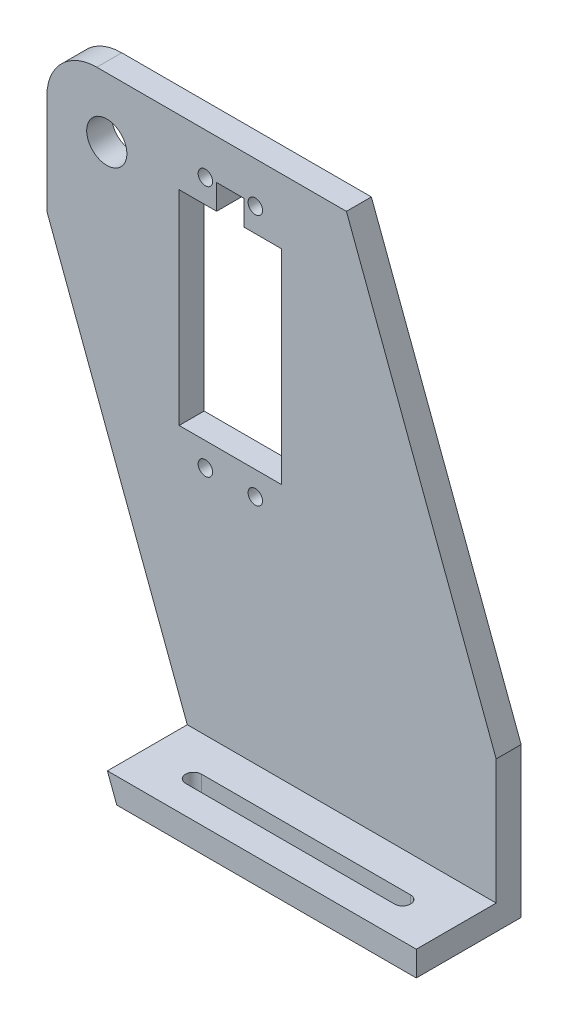
ISO-10303-21;
HEADER;
FILE_DESCRIPTION(('STEP AP214'),'2;1');
FILE_NAME('part.step','',(''),(''),'','','');
FILE_SCHEMA(('AUTOMOTIVE_DESIGN { 1 0 10303 214 1 1 1 1 }'));
ENDSEC;
DATA;
#1=APPLICATION_CONTEXT('core data for automotive mechanical design processes');
#2=APPLICATION_PROTOCOL_DEFINITION('international standard','automotive_design',2000,#1);
#3=PRODUCT_CONTEXT('',#1,'mechanical');
#4=PRODUCT('Part','Part','',(#3));
#5=PRODUCT_RELATED_PRODUCT_CATEGORY('part','',(#4));
#6=PRODUCT_DEFINITION_FORMATION('','',#4);
#7=PRODUCT_DEFINITION_CONTEXT('part definition',#1,'design');
#8=PRODUCT_DEFINITION('design','',#6,#7);
#9=PRODUCT_DEFINITION_SHAPE('','',#8);
#10=(LENGTH_UNIT() NAMED_UNIT(*) SI_UNIT(.MILLI.,.METRE.));
#11=(NAMED_UNIT(*) PLANE_ANGLE_UNIT() SI_UNIT($,.RADIAN.));
#12=(NAMED_UNIT(*) SI_UNIT($,.STERADIAN.) SOLID_ANGLE_UNIT());
#13=UNCERTAINTY_MEASURE_WITH_UNIT(LENGTH_MEASURE(1.E-05),#10,'distance_accuracy_value','');
#14=(GEOMETRIC_REPRESENTATION_CONTEXT(3) GLOBAL_UNCERTAINTY_ASSIGNED_CONTEXT((#13)) GLOBAL_UNIT_ASSIGNED_CONTEXT((#10,
#11,#12)) REPRESENTATION_CONTEXT('',''));
#15=CARTESIAN_POINT('',(0.,0.,0.));
#16=DIRECTION('',(0.,0.,1.));
#17=DIRECTION('',(1.,0.,0.));
#18=AXIS2_PLACEMENT_3D('',#15,#16,#17);
#19=CARTESIAN_POINT('',(-45.,2.5,21.));
#20=DIRECTION('',(0.,-1.,0.));
#21=DIRECTION('',(0.,0.,-1.));
#22=AXIS2_PLACEMENT_3D('',#19,#20,#21);
#23=PLANE('',#22);
#24=DIRECTION('',(1.,0.,0.));
#25=VECTOR('',#24,1.);
#26=CARTESIAN_POINT('',(-6.87500000000002,2.5,15.35));
#27=LINE('',#26,#25);
#28=CARTESIAN_POINT('',(-6.87500000000001,2.5,15.35));
#29=VERTEX_POINT('',#28);
#30=CARTESIAN_POINT('',(35.,2.5,15.35));
#31=VERTEX_POINT('',#30);
#32=EDGE_CURVE('E201',#29,#31,#27,.T.);
#33=ORIENTED_EDGE('',*,*,#32,.F.);
#34=CARTESIAN_POINT('',(-6.87500000000002,2.5,13.75));
#35=DIRECTION('',(0.,1.,0.));
#36=DIRECTION('',(0.,0.,1.));
#37=AXIS2_PLACEMENT_3D('',#34,#35,#36);
#38=CIRCLE('',#37,1.6);
#39=CARTESIAN_POINT('',(-6.87500000000002,2.5,12.15));
#40=VERTEX_POINT('',#39);
#41=EDGE_CURVE('E60',#40,#29,#38,.T.);
#42=ORIENTED_EDGE('',*,*,#41,.F.);
#43=DIRECTION('',(-1.,0.,0.));
#44=VECTOR('',#43,1.);
#45=CARTESIAN_POINT('',(-6.87500000000002,2.5,12.15));
#46=LINE('',#45,#44);
#47=CARTESIAN_POINT('',(35.,2.5,12.15));
#48=VERTEX_POINT('',#47);
#49=EDGE_CURVE('E208',#48,#40,#46,.T.);
#50=ORIENTED_EDGE('',*,*,#49,.F.);
#51=CARTESIAN_POINT('',(35.,2.5,13.75));
#52=DIRECTION('',(0.,1.,0.));
#53=DIRECTION('',(0.,0.,1.));
#54=AXIS2_PLACEMENT_3D('',#51,#52,#53);
#55=CIRCLE('',#54,1.6);
#56=EDGE_CURVE('E191',#31,#48,#55,.T.);
#57=ORIENTED_EDGE('',*,*,#56,.F.);
#58=EDGE_LOOP('',(#33,#42,#50,#57));
#59=FACE_BOUND('',#58,.T.);
#60=DIRECTION('',(1.,0.,0.));
#61=VECTOR('',#60,1.);
#62=CARTESIAN_POINT('',(-45.,2.5,5.));
#63=LINE('',#62,#61);
#64=CARTESIAN_POINT('',(-16.875,2.49999999999999,5.));
#65=VERTEX_POINT('',#64);
#66=CARTESIAN_POINT('',(45.,2.5,5.));
#67=VERTEX_POINT('',#66);
#68=EDGE_CURVE('E373',#65,#67,#63,.T.);
#69=ORIENTED_EDGE('',*,*,#68,.F.);
#70=DIRECTION('',(0.,0.,1.));
#71=VECTOR('',#70,1.);
#72=CARTESIAN_POINT('',(-16.875,2.5,21.));
#73=LINE('',#72,#71);
#74=CARTESIAN_POINT('',(-16.875,2.5,21.));
#75=VERTEX_POINT('',#74);
#76=EDGE_CURVE('E364',#65,#75,#73,.T.);
#77=ORIENTED_EDGE('',*,*,#76,.T.);
#78=DIRECTION('',(-1.,0.,0.));
#79=VECTOR('',#78,1.);
#80=CARTESIAN_POINT('',(-45.,2.5,21.));
#81=LINE('',#80,#79);
#82=CARTESIAN_POINT('',(45.,2.5,21.));
#83=VERTEX_POINT('',#82);
#84=EDGE_CURVE('E399',#83,#75,#81,.T.);
#85=ORIENTED_EDGE('',*,*,#84,.F.);
#86=DIRECTION('',(0.,0.,-1.));
#87=VECTOR('',#86,1.);
#88=CARTESIAN_POINT('',(45.,2.5,21.));
#89=LINE('',#88,#87);
#90=EDGE_CURVE('E420',#83,#67,#89,.T.);
#91=ORIENTED_EDGE('',*,*,#90,.T.);
#92=EDGE_LOOP('',(#69,#77,#85,#91));
#93=FACE_BOUND('',#92,.T.);
#94=ADVANCED_FACE('F44',(#59,#93),#23,.F.);
#95=CARTESIAN_POINT('',(45.,2.5,21.));
#96=DIRECTION('',(-1.,0.,0.));
#97=DIRECTION('',(0.,0.,1.));
#98=AXIS2_PLACEMENT_3D('',#95,#96,#97);
#99=PLANE('',#98);
#100=DIRECTION('',(0.,1.,0.));
#101=VECTOR('',#100,1.);
#102=CARTESIAN_POINT('',(45.,2.5,0.));
#103=LINE('',#102,#101);
#104=CARTESIAN_POINT('',(45.,-2.5,0.));
#105=VERTEX_POINT('',#104);
#106=CARTESIAN_POINT('',(45.,27.5,0.));
#107=VERTEX_POINT('',#106);
#108=EDGE_CURVE('E394',#105,#107,#103,.T.);
#109=ORIENTED_EDGE('',*,*,#108,.T.);
#110=DIRECTION('',(0.,0.,1.));
#111=VECTOR('',#110,1.);
#112=CARTESIAN_POINT('',(45.,27.5,0.));
#113=LINE('',#112,#111);
#114=CARTESIAN_POINT('',(45.,27.5,5.));
#115=VERTEX_POINT('',#114);
#116=EDGE_CURVE('E332',#107,#115,#113,.T.);
#117=ORIENTED_EDGE('',*,*,#116,.T.);
#118=DIRECTION('',(0.,-1.,0.));
#119=VECTOR('',#118,1.);
#120=CARTESIAN_POINT('',(45.,107.5,5.));
#121=LINE('',#120,#119);
#122=EDGE_CURVE('E384',#115,#67,#121,.T.);
#123=ORIENTED_EDGE('',*,*,#122,.T.);
#124=ORIENTED_EDGE('',*,*,#90,.F.);
#125=DIRECTION('',(0.,1.,0.));
#126=VECTOR('',#125,1.);
#127=CARTESIAN_POINT('',(45.,2.5,21.));
#128=LINE('',#127,#126);
#129=CARTESIAN_POINT('',(45.,-2.5,21.));
#130=VERTEX_POINT('',#129);
#131=EDGE_CURVE('E395',#130,#83,#128,.T.);
#132=ORIENTED_EDGE('',*,*,#131,.F.);
#133=DIRECTION('',(0.,0.,-1.));
#134=VECTOR('',#133,1.);
#135=CARTESIAN_POINT('',(45.,-2.5,21.));
#136=LINE('',#135,#134);
#137=EDGE_CURVE('E407',#130,#105,#136,.T.);
#138=ORIENTED_EDGE('',*,*,#137,.T.);
#139=EDGE_LOOP('',(#109,#117,#123,#124,#132,#138));
#140=FACE_BOUND('',#139,.T.);
#141=ADVANCED_FACE('F470',(#140),#99,.F.);
#142=CARTESIAN_POINT('',(-45.,2.5,21.));
#143=DIRECTION('',(1.,0.,0.));
#144=DIRECTION('',(0.,0.,-1.));
#145=AXIS2_PLACEMENT_3D('',#142,#143,#144);
#146=PLANE('',#145);
#147=DIRECTION('',(0.,-1.,0.));
#148=VECTOR('',#147,1.);
#149=CARTESIAN_POINT('',(-45.,2.5,0.));
#150=LINE('',#149,#148);
#151=CARTESIAN_POINT('',(-45.,97.5,0.));
#152=VERTEX_POINT('',#151);
#153=CARTESIAN_POINT('',(-45.,77.5,0.));
#154=VERTEX_POINT('',#153);
#155=EDGE_CURVE('E411',#152,#154,#150,.T.);
#156=ORIENTED_EDGE('',*,*,#155,.T.);
#157=DIRECTION('',(0.,0.,1.));
#158=VECTOR('',#157,1.);
#159=CARTESIAN_POINT('',(-45.,77.5,0.));
#160=LINE('',#159,#158);
#161=CARTESIAN_POINT('',(-45.,77.5,5.));
#162=VERTEX_POINT('',#161);
#163=EDGE_CURVE('E345',#154,#162,#160,.T.);
#164=ORIENTED_EDGE('',*,*,#163,.T.);
#165=DIRECTION('',(0.,-1.,0.));
#166=VECTOR('',#165,1.);
#167=CARTESIAN_POINT('',(-45.,107.5,5.));
#168=LINE('',#167,#166);
#169=CARTESIAN_POINT('',(-45.,97.5,5.));
#170=VERTEX_POINT('',#169);
#171=EDGE_CURVE('E390',#170,#162,#168,.T.);
#172=ORIENTED_EDGE('',*,*,#171,.F.);
#173=DIRECTION('',(0.,0.,1.));
#174=VECTOR('',#173,1.);
#175=CARTESIAN_POINT('',(-45.,97.5,0.));
#176=LINE('',#175,#174);
#177=EDGE_CURVE('E431',#170,#152,#176,.F.);
#178=ORIENTED_EDGE('',*,*,#177,.T.);
#179=EDGE_LOOP('',(#156,#164,#172,#178));
#180=FACE_BOUND('',#179,.T.);
#181=ADVANCED_FACE('F475',(#180),#146,.F.);
#182=CARTESIAN_POINT('',(-45.,-2.5,21.));
#183=DIRECTION('',(0.,1.,0.));
#184=DIRECTION('',(0.,0.,1.));
#185=AXIS2_PLACEMENT_3D('',#182,#183,#184);
#186=PLANE('',#185);
#187=DIRECTION('',(-1.,0.,0.));
#188=VECTOR('',#187,1.);
#189=CARTESIAN_POINT('',(-45.,-2.5,12.15));
#190=LINE('',#189,#188);
#191=CARTESIAN_POINT('',(35.,-2.5,12.15));
#192=VERTEX_POINT('',#191);
#193=CARTESIAN_POINT('',(-6.87500000000002,-2.5,12.15));
#194=VERTEX_POINT('',#193);
#195=EDGE_CURVE('E53',#192,#194,#190,.T.);
#196=ORIENTED_EDGE('',*,*,#195,.T.);
#197=CARTESIAN_POINT('',(-6.87500000000002,-2.5,13.75));
#198=DIRECTION('',(0.,1.,0.));
#199=DIRECTION('',(0.,0.,1.));
#200=AXIS2_PLACEMENT_3D('',#197,#198,#199);
#201=CIRCLE('',#200,1.6);
#202=CARTESIAN_POINT('',(-6.87500000000002,-2.5,15.35));
#203=VERTEX_POINT('',#202);
#204=EDGE_CURVE('E11',#194,#203,#201,.T.);
#205=ORIENTED_EDGE('',*,*,#204,.T.);
#206=DIRECTION('',(1.,0.,0.));
#207=VECTOR('',#206,1.);
#208=CARTESIAN_POINT('',(-45.,-2.5,15.35));
#209=LINE('',#208,#207);
#210=CARTESIAN_POINT('',(35.,-2.5,15.35));
#211=VERTEX_POINT('',#210);
#212=EDGE_CURVE('E442',#203,#211,#209,.T.);
#213=ORIENTED_EDGE('',*,*,#212,.T.);
#214=CARTESIAN_POINT('',(35.,-2.5,13.75));
#215=DIRECTION('',(0.,1.,0.));
#216=DIRECTION('',(0.,0.,1.));
#217=AXIS2_PLACEMENT_3D('',#214,#215,#216);
#218=CIRCLE('',#217,1.6);
#219=EDGE_CURVE('E194',#211,#192,#218,.T.);
#220=ORIENTED_EDGE('',*,*,#219,.T.);
#221=EDGE_LOOP('',(#196,#205,#213,#220));
#222=FACE_BOUND('',#221,.T.);
#223=DIRECTION('',(1.,0.,0.));
#224=VECTOR('',#223,1.);
#225=CARTESIAN_POINT('',(-45.,-2.5,21.));
#226=LINE('',#225,#224);
#227=CARTESIAN_POINT('',(-15.,-2.5,21.));
#228=VERTEX_POINT('',#227);
#229=EDGE_CURVE('E404',#228,#130,#226,.T.);
#230=ORIENTED_EDGE('',*,*,#229,.F.);
#231=DIRECTION('',(0.,0.,1.));
#232=VECTOR('',#231,1.);
#233=CARTESIAN_POINT('',(-15.,-2.5,0.));
#234=LINE('',#233,#232);
#235=CARTESIAN_POINT('',(-15.,-2.5,0.));
#236=VERTEX_POINT('',#235);
#237=EDGE_CURVE('E340',#236,#228,#234,.T.);
#238=ORIENTED_EDGE('',*,*,#237,.F.);
#239=DIRECTION('',(1.,0.,0.));
#240=VECTOR('',#239,1.);
#241=CARTESIAN_POINT('',(-45.,-2.5,0.));
#242=LINE('',#241,#240);
#243=EDGE_CURVE('E400',#236,#105,#242,.T.);
#244=ORIENTED_EDGE('',*,*,#243,.T.);
#245=ORIENTED_EDGE('',*,*,#137,.F.);
#246=EDGE_LOOP('',(#230,#238,#244,#245));
#247=FACE_BOUND('',#246,.T.);
#248=ADVANCED_FACE('F449',(#222,#247),#186,.F.);
#249=CARTESIAN_POINT('',(0.,0.,21.));
#250=DIRECTION('',(0.,0.,1.));
#251=DIRECTION('',(1.,0.,0.));
#252=AXIS2_PLACEMENT_3D('',#249,#250,#251);
#253=PLANE('',#252);
#254=DIRECTION('',(-0.351123441588392,0.936329177569045,0.));
#255=VECTOR('',#254,1.);
#256=CARTESIAN_POINT('',(-45.,77.5,21.));
#257=LINE('',#256,#255);
#258=EDGE_CURVE('E341',#228,#75,#257,.T.);
#259=ORIENTED_EDGE('',*,*,#258,.F.);
#260=ORIENTED_EDGE('',*,*,#229,.T.);
#261=ORIENTED_EDGE('',*,*,#131,.T.);
#262=ORIENTED_EDGE('',*,*,#84,.T.);
#263=EDGE_LOOP('',(#259,#260,#261,#262));
#264=FACE_BOUND('',#263,.T.);
#265=ADVANCED_FACE('F482',(#264),#253,.T.);
#266=CARTESIAN_POINT('',(0.,0.,0.));
#267=DIRECTION('',(0.,0.,1.));
#268=DIRECTION('',(1.,0.,0.));
#269=AXIS2_PLACEMENT_3D('',#266,#267,#268);
#270=PLANE('',#269);
#271=DIRECTION('',(0.,1.,0.));
#272=VECTOR('',#271,1.);
#273=CARTESIAN_POINT('',(-5.50000000000001,0.,0.));
#274=LINE('',#273,#272);
#275=CARTESIAN_POINT('',(-5.50000000000001,94.5,0.));
#276=VERTEX_POINT('',#275);
#277=CARTESIAN_POINT('',(-5.50000000000001,99.5,0.));
#278=VERTEX_POINT('',#277);
#279=EDGE_CURVE('E248',#276,#278,#274,.T.);
#280=ORIENTED_EDGE('',*,*,#279,.T.);
#281=DIRECTION('',(-1.,0.,0.));
#282=VECTOR('',#281,1.);
#283=CARTESIAN_POINT('',(0.,99.5,0.));
#284=LINE('',#283,#282);
#285=CARTESIAN_POINT('',(-11.,99.5,0.));
#286=VERTEX_POINT('',#285);
#287=EDGE_CURVE('E223',#278,#286,#284,.T.);
#288=ORIENTED_EDGE('',*,*,#287,.T.);
#289=DIRECTION('',(0.,-1.,0.));
#290=VECTOR('',#289,1.);
#291=CARTESIAN_POINT('',(-11.,0.,0.));
#292=LINE('',#291,#290);
#293=CARTESIAN_POINT('',(-11.,94.5,0.));
#294=VERTEX_POINT('',#293);
#295=EDGE_CURVE('E227',#286,#294,#292,.T.);
#296=ORIENTED_EDGE('',*,*,#295,.T.);
#297=DIRECTION('',(1.,0.,0.));
#298=VECTOR('',#297,1.);
#299=CARTESIAN_POINT('',(0.,94.5,0.));
#300=LINE('',#299,#298);
#301=CARTESIAN_POINT('',(-18.5,94.5,0.));
#302=VERTEX_POINT('',#301);
#303=EDGE_CURVE('E232',#302,#294,#300,.T.);
#304=ORIENTED_EDGE('',*,*,#303,.F.);
#305=DIRECTION('',(0.,-1.,0.));
#306=VECTOR('',#305,1.);
#307=CARTESIAN_POINT('',(-18.5,0.,0.));
#308=LINE('',#307,#306);
#309=CARTESIAN_POINT('',(-18.5,53.6,0.));
#310=VERTEX_POINT('',#309);
#311=EDGE_CURVE('E236',#302,#310,#308,.T.);
#312=ORIENTED_EDGE('',*,*,#311,.T.);
#313=DIRECTION('',(1.,0.,0.));
#314=VECTOR('',#313,1.);
#315=CARTESIAN_POINT('',(0.,53.6,0.));
#316=LINE('',#315,#314);
#317=CARTESIAN_POINT('',(1.99999999999999,53.6,0.));
#318=VERTEX_POINT('',#317);
#319=EDGE_CURVE('E241',#310,#318,#316,.T.);
#320=ORIENTED_EDGE('',*,*,#319,.T.);
#321=DIRECTION('',(0.,-1.,0.));
#322=VECTOR('',#321,1.);
#323=CARTESIAN_POINT('',(2.,0.,0.));
#324=LINE('',#323,#322);
#325=CARTESIAN_POINT('',(1.99999999999999,94.5,0.));
#326=VERTEX_POINT('',#325);
#327=EDGE_CURVE('E245',#326,#318,#324,.T.);
#328=ORIENTED_EDGE('',*,*,#327,.F.);
#329=EDGE_CURVE('E237',#276,#326,#300,.T.);
#330=ORIENTED_EDGE('',*,*,#329,.F.);
#331=EDGE_LOOP('',(#280,#288,#296,#304,#312,#320,#328,#330));
#332=FACE_BOUND('',#331,.T.);
#333=CARTESIAN_POINT('',(-13.25,99.25,0.));
#334=DIRECTION('',(0.,0.,1.));
#335=DIRECTION('',(1.,0.,0.));
#336=AXIS2_PLACEMENT_3D('',#333,#334,#335);
#337=CIRCLE('',#336,1.45);
#338=CARTESIAN_POINT('',(-11.8,99.25,0.));
#339=VERTEX_POINT('',#338);
#340=EDGE_CURVE('E282',#339,#339,#337,.T.);
#341=ORIENTED_EDGE('',*,*,#340,.T.);
#342=EDGE_LOOP('',(#341));
#343=FACE_BOUND('',#342,.T.);
#344=CARTESIAN_POINT('',(-3.25,99.25,0.));
#345=DIRECTION('',(0.,0.,1.));
#346=DIRECTION('',(1.,0.,0.));
#347=AXIS2_PLACEMENT_3D('',#344,#345,#346);
#348=CIRCLE('',#347,1.45);
#349=CARTESIAN_POINT('',(-1.8,99.25,0.));
#350=VERTEX_POINT('',#349);
#351=EDGE_CURVE('E317',#350,#350,#348,.T.);
#352=ORIENTED_EDGE('',*,*,#351,.T.);
#353=EDGE_LOOP('',(#352));
#354=FACE_BOUND('',#353,.T.);
#355=CARTESIAN_POINT('',(-3.25000000000001,48.85,0.));
#356=DIRECTION('',(0.,0.,1.));
#357=DIRECTION('',(1.,0.,0.));
#358=AXIS2_PLACEMENT_3D('',#355,#356,#357);
#359=CIRCLE('',#358,1.45);
#360=CARTESIAN_POINT('',(-1.80000000000001,48.85,0.));
#361=VERTEX_POINT('',#360);
#362=EDGE_CURVE('E309',#361,#361,#359,.T.);
#363=ORIENTED_EDGE('',*,*,#362,.T.);
#364=EDGE_LOOP('',(#363));
#365=FACE_BOUND('',#364,.T.);
#366=CARTESIAN_POINT('',(-13.25,48.85,0.));
#367=DIRECTION('',(0.,0.,1.));
#368=DIRECTION('',(1.,0.,0.));
#369=AXIS2_PLACEMENT_3D('',#366,#367,#368);
#370=CIRCLE('',#369,1.45);
#371=CARTESIAN_POINT('',(-11.8,48.85,0.));
#372=VERTEX_POINT('',#371);
#373=EDGE_CURVE('E328',#372,#372,#370,.T.);
#374=ORIENTED_EDGE('',*,*,#373,.T.);
#375=EDGE_LOOP('',(#374));
#376=FACE_BOUND('',#375,.T.);
#377=CARTESIAN_POINT('',(-33.,95.5,0.));
#378=DIRECTION('',(0.,0.,1.));
#379=DIRECTION('',(1.,0.,0.));
#380=AXIS2_PLACEMENT_3D('',#377,#378,#379);
#381=CIRCLE('',#380,4.025);
#382=CARTESIAN_POINT('',(-28.975,95.5,0.));
#383=VERTEX_POINT('',#382);
#384=EDGE_CURVE('E369',#383,#383,#381,.T.);
#385=ORIENTED_EDGE('',*,*,#384,.T.);
#386=EDGE_LOOP('',(#385));
#387=FACE_BOUND('',#386,.T.);
#388=ORIENTED_EDGE('',*,*,#243,.F.);
#389=DIRECTION('',(-0.351123441588392,0.936329177569045,0.));
#390=VECTOR('',#389,1.);
#391=CARTESIAN_POINT('',(-45.,77.5,0.));
#392=LINE('',#391,#390);
#393=EDGE_CURVE('E336',#236,#154,#392,.T.);
#394=ORIENTED_EDGE('',*,*,#393,.T.);
#395=ORIENTED_EDGE('',*,*,#155,.F.);
#396=CARTESIAN_POINT('',(-35.,97.5,0.));
#397=DIRECTION('',(0.,0.,1.));
#398=DIRECTION('',(1.,0.,0.));
#399=AXIS2_PLACEMENT_3D('',#396,#397,#398);
#400=CIRCLE('',#399,10.);
#401=CARTESIAN_POINT('',(-35.,107.5,0.));
#402=VERTEX_POINT('',#401);
#403=EDGE_CURVE('E434',#152,#402,#400,.F.);
#404=ORIENTED_EDGE('',*,*,#403,.T.);
#405=DIRECTION('',(-1.,0.,0.));
#406=VECTOR('',#405,1.);
#407=CARTESIAN_POINT('',(-45.,107.5,0.));
#408=LINE('',#407,#406);
#409=CARTESIAN_POINT('',(15.,107.5,0.));
#410=VERTEX_POINT('',#409);
#411=EDGE_CURVE('E381',#410,#402,#408,.T.);
#412=ORIENTED_EDGE('',*,*,#411,.F.);
#413=DIRECTION('',(0.351123441588392,-0.936329177569045,0.));
#414=VECTOR('',#413,1.);
#415=CARTESIAN_POINT('',(15.,107.5,0.));
#416=LINE('',#415,#414);
#417=EDGE_CURVE('E344',#410,#107,#416,.T.);
#418=ORIENTED_EDGE('',*,*,#417,.T.);
#419=ORIENTED_EDGE('',*,*,#108,.F.);
#420=EDGE_LOOP('',(#388,#394,#395,#404,#412,#418,#419));
#421=FACE_BOUND('',#420,.T.);
#422=ADVANCED_FACE('F483',(#332,#343,#354,#365,#376,#387,#421),#270,.F.);
#423=CARTESIAN_POINT('',(-45.,107.5,5.));
#424=DIRECTION('',(0.,0.,-1.));
#425=DIRECTION('',(-1.,0.,0.));
#426=AXIS2_PLACEMENT_3D('',#423,#424,#425);
#427=PLANE('',#426);
#428=DIRECTION('',(0.,-1.,0.));
#429=VECTOR('',#428,1.);
#430=CARTESIAN_POINT('',(-11.,0.,5.));
#431=LINE('',#430,#429);
#432=CARTESIAN_POINT('',(-11.,99.5,5.));
#433=VERTEX_POINT('',#432);
#434=CARTESIAN_POINT('',(-11.,94.5,5.));
#435=VERTEX_POINT('',#434);
#436=EDGE_CURVE('E255',#433,#435,#431,.T.);
#437=ORIENTED_EDGE('',*,*,#436,.F.);
#438=DIRECTION('',(-1.,0.,0.));
#439=VECTOR('',#438,1.);
#440=CARTESIAN_POINT('',(0.,99.5,5.));
#441=LINE('',#440,#439);
#442=CARTESIAN_POINT('',(-5.50000000000001,99.5,5.));
#443=VERTEX_POINT('',#442);
#444=EDGE_CURVE('E218',#443,#433,#441,.T.);
#445=ORIENTED_EDGE('',*,*,#444,.F.);
#446=DIRECTION('',(0.,1.,0.));
#447=VECTOR('',#446,1.);
#448=CARTESIAN_POINT('',(-5.50000000000001,0.,5.));
#449=LINE('',#448,#447);
#450=CARTESIAN_POINT('',(-5.50000000000001,94.5,5.));
#451=VERTEX_POINT('',#450);
#452=EDGE_CURVE('E228',#451,#443,#449,.T.);
#453=ORIENTED_EDGE('',*,*,#452,.F.);
#454=DIRECTION('',(1.,0.,0.));
#455=VECTOR('',#454,1.);
#456=CARTESIAN_POINT('',(0.,94.5,5.));
#457=LINE('',#456,#455);
#458=CARTESIAN_POINT('',(1.99999999999999,94.5,5.));
#459=VERTEX_POINT('',#458);
#460=EDGE_CURVE('E264',#451,#459,#457,.T.);
#461=ORIENTED_EDGE('',*,*,#460,.T.);
#462=DIRECTION('',(0.,-1.,0.));
#463=VECTOR('',#462,1.);
#464=CARTESIAN_POINT('',(2.,0.,5.));
#465=LINE('',#464,#463);
#466=CARTESIAN_POINT('',(1.99999999999999,53.6,5.));
#467=VERTEX_POINT('',#466);
#468=EDGE_CURVE('E272',#459,#467,#465,.T.);
#469=ORIENTED_EDGE('',*,*,#468,.T.);
#470=DIRECTION('',(1.,0.,0.));
#471=VECTOR('',#470,1.);
#472=CARTESIAN_POINT('',(0.,53.6,5.));
#473=LINE('',#472,#471);
#474=CARTESIAN_POINT('',(-18.5,53.6,5.));
#475=VERTEX_POINT('',#474);
#476=EDGE_CURVE('E268',#475,#467,#473,.T.);
#477=ORIENTED_EDGE('',*,*,#476,.F.);
#478=DIRECTION('',(0.,-1.,0.));
#479=VECTOR('',#478,1.);
#480=CARTESIAN_POINT('',(-18.5,0.,5.));
#481=LINE('',#480,#479);
#482=CARTESIAN_POINT('',(-18.5,94.5,5.));
#483=VERTEX_POINT('',#482);
#484=EDGE_CURVE('E263',#483,#475,#481,.T.);
#485=ORIENTED_EDGE('',*,*,#484,.F.);
#486=EDGE_CURVE('E259',#483,#435,#457,.T.);
#487=ORIENTED_EDGE('',*,*,#486,.T.);
#488=EDGE_LOOP('',(#437,#445,#453,#461,#469,#477,#485,#487));
#489=FACE_BOUND('',#488,.T.);
#490=CARTESIAN_POINT('',(-13.25,99.25,5.));
#491=DIRECTION('',(0.,0.,1.));
#492=DIRECTION('',(1.,0.,0.));
#493=AXIS2_PLACEMENT_3D('',#490,#491,#492);
#494=CIRCLE('',#493,1.45);
#495=CARTESIAN_POINT('',(-11.8,99.25,5.));
#496=VERTEX_POINT('',#495);
#497=EDGE_CURVE('E321',#496,#496,#494,.T.);
#498=ORIENTED_EDGE('',*,*,#497,.F.);
#499=EDGE_LOOP('',(#498));
#500=FACE_BOUND('',#499,.T.);
#501=CARTESIAN_POINT('',(-3.25,99.25,5.));
#502=DIRECTION('',(0.,0.,1.));
#503=DIRECTION('',(1.,0.,0.));
#504=AXIS2_PLACEMENT_3D('',#501,#502,#503);
#505=CIRCLE('',#504,1.45);
#506=CARTESIAN_POINT('',(-1.8,99.25,5.));
#507=VERTEX_POINT('',#506);
#508=EDGE_CURVE('E313',#507,#507,#505,.T.);
#509=ORIENTED_EDGE('',*,*,#508,.F.);
#510=EDGE_LOOP('',(#509));
#511=FACE_BOUND('',#510,.T.);
#512=CARTESIAN_POINT('',(-3.25000000000001,48.85,5.));
#513=DIRECTION('',(0.,0.,1.));
#514=DIRECTION('',(1.,0.,0.));
#515=AXIS2_PLACEMENT_3D('',#512,#513,#514);
#516=CIRCLE('',#515,1.45);
#517=CARTESIAN_POINT('',(-1.80000000000001,48.85,5.));
#518=VERTEX_POINT('',#517);
#519=EDGE_CURVE('E304',#518,#518,#516,.T.);
#520=ORIENTED_EDGE('',*,*,#519,.F.);
#521=EDGE_LOOP('',(#520));
#522=FACE_BOUND('',#521,.T.);
#523=CARTESIAN_POINT('',(-13.25,48.85,5.));
#524=DIRECTION('',(0.,0.,1.));
#525=DIRECTION('',(1.,0.,0.));
#526=AXIS2_PLACEMENT_3D('',#523,#524,#525);
#527=CIRCLE('',#526,1.45);
#528=CARTESIAN_POINT('',(-11.8,48.85,5.));
#529=VERTEX_POINT('',#528);
#530=EDGE_CURVE('E308',#529,#529,#527,.T.);
#531=ORIENTED_EDGE('',*,*,#530,.F.);
#532=EDGE_LOOP('',(#531));
#533=FACE_BOUND('',#532,.T.);
#534=CARTESIAN_POINT('',(-33.,95.5,5.));
#535=DIRECTION('',(0.,0.,1.));
#536=DIRECTION('',(1.,0.,0.));
#537=AXIS2_PLACEMENT_3D('',#534,#535,#536);
#538=CIRCLE('',#537,4.025);
#539=CARTESIAN_POINT('',(-28.975,95.5,5.));
#540=VERTEX_POINT('',#539);
#541=EDGE_CURVE('E368',#540,#540,#538,.T.);
#542=ORIENTED_EDGE('',*,*,#541,.F.);
#543=EDGE_LOOP('',(#542));
#544=FACE_BOUND('',#543,.T.);
#545=ORIENTED_EDGE('',*,*,#171,.T.);
#546=DIRECTION('',(0.351123441588392,-0.936329177569045,0.));
#547=VECTOR('',#546,1.);
#548=CARTESIAN_POINT('',(-54.8630136986301,103.801369863014,5.));
#549=LINE('',#548,#547);
#550=EDGE_CURVE('E438',#162,#65,#549,.T.);
#551=ORIENTED_EDGE('',*,*,#550,.T.);
#552=ORIENTED_EDGE('',*,*,#68,.T.);
#553=ORIENTED_EDGE('',*,*,#122,.F.);
#554=DIRECTION('',(-0.351123441588392,0.936329177569045,0.));
#555=VECTOR('',#554,1.);
#556=CARTESIAN_POINT('',(7.60273972602739,127.22602739726,5.));
#557=LINE('',#556,#555);
#558=CARTESIAN_POINT('',(15.,107.5,5.));
#559=VERTEX_POINT('',#558);
#560=EDGE_CURVE('E349',#115,#559,#557,.T.);
#561=ORIENTED_EDGE('',*,*,#560,.T.);
#562=DIRECTION('',(1.,0.,0.));
#563=VECTOR('',#562,1.);
#564=CARTESIAN_POINT('',(-45.,107.5,5.));
#565=LINE('',#564,#563);
#566=CARTESIAN_POINT('',(-35.,107.5,5.));
#567=VERTEX_POINT('',#566);
#568=EDGE_CURVE('E377',#567,#559,#565,.T.);
#569=ORIENTED_EDGE('',*,*,#568,.F.);
#570=CARTESIAN_POINT('',(-35.,97.5,5.));
#571=DIRECTION('',(0.,0.,-1.));
#572=DIRECTION('',(-1.,0.,0.));
#573=AXIS2_PLACEMENT_3D('',#570,#571,#572);
#574=CIRCLE('',#573,10.);
#575=EDGE_CURVE('E428',#567,#170,#574,.F.);
#576=ORIENTED_EDGE('',*,*,#575,.T.);
#577=EDGE_LOOP('',(#545,#551,#552,#553,#561,#569,#576));
#578=FACE_BOUND('',#577,.T.);
#579=ADVANCED_FACE('F486',(#489,#500,#511,#522,#533,#544,#578),#427,.F.);
#580=CARTESIAN_POINT('',(0.,107.5,0.));
#581=DIRECTION('',(0.,1.,0.));
#582=DIRECTION('',(0.,0.,1.));
#583=AXIS2_PLACEMENT_3D('',#580,#581,#582);
#584=PLANE('',#583);
#585=DIRECTION('',(0.,0.,1.));
#586=VECTOR('',#585,1.);
#587=CARTESIAN_POINT('',(15.,107.5,0.));
#588=LINE('',#587,#586);
#589=EDGE_CURVE('E352',#410,#559,#588,.T.);
#590=ORIENTED_EDGE('',*,*,#589,.F.);
#591=ORIENTED_EDGE('',*,*,#411,.T.);
#592=DIRECTION('',(0.,0.,1.));
#593=VECTOR('',#592,1.);
#594=CARTESIAN_POINT('',(-35.,107.5,5.));
#595=LINE('',#594,#593);
#596=EDGE_CURVE('E424',#402,#567,#595,.T.);
#597=ORIENTED_EDGE('',*,*,#596,.T.);
#598=ORIENTED_EDGE('',*,*,#568,.T.);
#599=EDGE_LOOP('',(#590,#591,#597,#598));
#600=FACE_BOUND('',#599,.T.);
#601=ADVANCED_FACE('F493',(#600),#584,.T.);
#602=CARTESIAN_POINT('',(-35.,97.5,0.));
#603=DIRECTION('',(0.,0.,-1.));
#604=DIRECTION('',(-1.,0.,0.));
#605=AXIS2_PLACEMENT_3D('',#602,#603,#604);
#606=CYLINDRICAL_SURFACE('',#605,10.);
#607=ORIENTED_EDGE('',*,*,#403,.F.);
#608=ORIENTED_EDGE('',*,*,#177,.F.);
#609=ORIENTED_EDGE('',*,*,#575,.F.);
#610=ORIENTED_EDGE('',*,*,#596,.F.);
#611=EDGE_LOOP('',(#607,#608,#609,#610));
#612=FACE_BOUND('',#611,.T.);
#613=ADVANCED_FACE('F46',(#612),#606,.T.);
#614=CARTESIAN_POINT('',(-33.,95.5,0.));
#615=DIRECTION('',(0.,0.,1.));
#616=DIRECTION('',(1.,0.,0.));
#617=AXIS2_PLACEMENT_3D('',#614,#615,#616);
#618=CYLINDRICAL_SURFACE('',#617,4.025);
#619=ORIENTED_EDGE('',*,*,#384,.F.);
#620=EDGE_LOOP('',(#619));
#621=FACE_BOUND('',#620,.T.);
#622=ORIENTED_EDGE('',*,*,#541,.T.);
#623=EDGE_LOOP('',(#622));
#624=FACE_BOUND('',#623,.T.);
#625=ADVANCED_FACE('F498',(#621,#624),#618,.F.);
#626=CARTESIAN_POINT('',(15.,107.5,0.));
#627=DIRECTION('',(-0.936329177569044,-0.351123441588392,0.));
#628=DIRECTION('',(0.351123441588392,-0.936329177569045,0.));
#629=AXIS2_PLACEMENT_3D('',#626,#627,#628);
#630=PLANE('',#629);
#631=ORIENTED_EDGE('',*,*,#116,.F.);
#632=ORIENTED_EDGE('',*,*,#417,.F.);
#633=ORIENTED_EDGE('',*,*,#589,.T.);
#634=ORIENTED_EDGE('',*,*,#560,.F.);
#635=EDGE_LOOP('',(#631,#632,#633,#634));
#636=FACE_BOUND('',#635,.T.);
#637=ADVANCED_FACE('F501',(#636),#630,.F.);
#638=CARTESIAN_POINT('',(-45.,77.5,0.));
#639=DIRECTION('',(0.936329177569044,0.351123441588392,0.));
#640=DIRECTION('',(-0.351123441588392,0.936329177569045,0.));
#641=AXIS2_PLACEMENT_3D('',#638,#639,#640);
#642=PLANE('',#641);
#643=ORIENTED_EDGE('',*,*,#550,.F.);
#644=ORIENTED_EDGE('',*,*,#163,.F.);
#645=ORIENTED_EDGE('',*,*,#393,.F.);
#646=ORIENTED_EDGE('',*,*,#237,.T.);
#647=ORIENTED_EDGE('',*,*,#258,.T.);
#648=ORIENTED_EDGE('',*,*,#76,.F.);
#649=EDGE_LOOP('',(#643,#644,#645,#646,#647,#648));
#650=FACE_BOUND('',#649,.T.);
#651=ADVANCED_FACE('F505',(#650),#642,.F.);
#652=CARTESIAN_POINT('',(-13.25,48.85,0.));
#653=DIRECTION('',(0.,0.,1.));
#654=DIRECTION('',(1.,0.,0.));
#655=AXIS2_PLACEMENT_3D('',#652,#653,#654);
#656=CYLINDRICAL_SURFACE('',#655,1.45);
#657=ORIENTED_EDGE('',*,*,#373,.F.);
#658=EDGE_LOOP('',(#657));
#659=FACE_BOUND('',#658,.T.);
#660=ORIENTED_EDGE('',*,*,#530,.T.);
#661=EDGE_LOOP('',(#660));
#662=FACE_BOUND('',#661,.T.);
#663=ADVANCED_FACE('F509',(#659,#662),#656,.F.);
#664=CARTESIAN_POINT('',(-3.25000000000001,48.85,0.));
#665=DIRECTION('',(0.,0.,1.));
#666=DIRECTION('',(1.,0.,0.));
#667=AXIS2_PLACEMENT_3D('',#664,#665,#666);
#668=CYLINDRICAL_SURFACE('',#667,1.45);
#669=ORIENTED_EDGE('',*,*,#362,.F.);
#670=EDGE_LOOP('',(#669));
#671=FACE_BOUND('',#670,.T.);
#672=ORIENTED_EDGE('',*,*,#519,.T.);
#673=EDGE_LOOP('',(#672));
#674=FACE_BOUND('',#673,.T.);
#675=ADVANCED_FACE('F513',(#671,#674),#668,.F.);
#676=CARTESIAN_POINT('',(-3.25,99.25,0.));
#677=DIRECTION('',(0.,0.,1.));
#678=DIRECTION('',(1.,0.,0.));
#679=AXIS2_PLACEMENT_3D('',#676,#677,#678);
#680=CYLINDRICAL_SURFACE('',#679,1.45);
#681=ORIENTED_EDGE('',*,*,#351,.F.);
#682=EDGE_LOOP('',(#681));
#683=FACE_BOUND('',#682,.T.);
#684=ORIENTED_EDGE('',*,*,#508,.T.);
#685=EDGE_LOOP('',(#684));
#686=FACE_BOUND('',#685,.T.);
#687=ADVANCED_FACE('F519',(#683,#686),#680,.F.);
#688=CARTESIAN_POINT('',(-13.25,99.25,0.));
#689=DIRECTION('',(0.,0.,1.));
#690=DIRECTION('',(1.,0.,0.));
#691=AXIS2_PLACEMENT_3D('',#688,#689,#690);
#692=CYLINDRICAL_SURFACE('',#691,1.45);
#693=ORIENTED_EDGE('',*,*,#340,.F.);
#694=EDGE_LOOP('',(#693));
#695=FACE_BOUND('',#694,.T.);
#696=ORIENTED_EDGE('',*,*,#497,.T.);
#697=EDGE_LOOP('',(#696));
#698=FACE_BOUND('',#697,.T.);
#699=ADVANCED_FACE('F515',(#695,#698),#692,.F.);
#700=CARTESIAN_POINT('',(0.,99.5,0.));
#701=DIRECTION('',(0.,1.,0.));
#702=DIRECTION('',(0.,0.,1.));
#703=AXIS2_PLACEMENT_3D('',#700,#701,#702);
#704=PLANE('',#703);
#705=ORIENTED_EDGE('',*,*,#444,.T.);
#706=DIRECTION('',(0.,0.,1.));
#707=VECTOR('',#706,1.);
#708=CARTESIAN_POINT('',(-11.,99.5,0.));
#709=LINE('',#708,#707);
#710=EDGE_CURVE('E252',#286,#433,#709,.T.);
#711=ORIENTED_EDGE('',*,*,#710,.F.);
#712=ORIENTED_EDGE('',*,*,#287,.F.);
#713=DIRECTION('',(0.,0.,1.));
#714=VECTOR('',#713,1.);
#715=CARTESIAN_POINT('',(-5.50000000000001,99.5,0.));
#716=LINE('',#715,#714);
#717=EDGE_CURVE('E279',#278,#443,#716,.T.);
#718=ORIENTED_EDGE('',*,*,#717,.T.);
#719=EDGE_LOOP('',(#705,#711,#712,#718));
#720=FACE_BOUND('',#719,.T.);
#721=ADVANCED_FACE('F518',(#720),#704,.F.);
#722=CARTESIAN_POINT('',(-5.50000000000001,0.,0.));
#723=DIRECTION('',(1.,0.,0.));
#724=DIRECTION('',(0.,0.,-1.));
#725=AXIS2_PLACEMENT_3D('',#722,#723,#724);
#726=PLANE('',#725);
#727=ORIENTED_EDGE('',*,*,#452,.T.);
#728=ORIENTED_EDGE('',*,*,#717,.F.);
#729=ORIENTED_EDGE('',*,*,#279,.F.);
#730=DIRECTION('',(0.,0.,1.));
#731=VECTOR('',#730,1.);
#732=CARTESIAN_POINT('',(-5.50000000000001,94.5,0.));
#733=LINE('',#732,#731);
#734=EDGE_CURVE('E283',#276,#451,#733,.T.);
#735=ORIENTED_EDGE('',*,*,#734,.T.);
#736=EDGE_LOOP('',(#727,#728,#729,#735));
#737=FACE_BOUND('',#736,.T.);
#738=ADVANCED_FACE('F528',(#737),#726,.F.);
#739=CARTESIAN_POINT('',(0.,94.5,0.));
#740=DIRECTION('',(0.,-1.,0.));
#741=DIRECTION('',(0.,0.,-1.));
#742=AXIS2_PLACEMENT_3D('',#739,#740,#741);
#743=PLANE('',#742);
#744=ORIENTED_EDGE('',*,*,#460,.F.);
#745=ORIENTED_EDGE('',*,*,#734,.F.);
#746=ORIENTED_EDGE('',*,*,#329,.T.);
#747=DIRECTION('',(0.,0.,1.));
#748=VECTOR('',#747,1.);
#749=CARTESIAN_POINT('',(1.99999999999999,94.5,0.));
#750=LINE('',#749,#748);
#751=EDGE_CURVE('E286',#326,#459,#750,.T.);
#752=ORIENTED_EDGE('',*,*,#751,.T.);
#753=EDGE_LOOP('',(#744,#745,#746,#752));
#754=FACE_BOUND('',#753,.T.);
#755=ADVANCED_FACE('F542',(#754),#743,.T.);
#756=CARTESIAN_POINT('',(2.,0.,0.));
#757=DIRECTION('',(-1.,0.,0.));
#758=DIRECTION('',(0.,-1.,0.));
#759=AXIS2_PLACEMENT_3D('',#756,#757,#758);
#760=PLANE('',#759);
#761=ORIENTED_EDGE('',*,*,#468,.F.);
#762=ORIENTED_EDGE('',*,*,#751,.F.);
#763=ORIENTED_EDGE('',*,*,#327,.T.);
#764=DIRECTION('',(0.,0.,1.));
#765=VECTOR('',#764,1.);
#766=CARTESIAN_POINT('',(1.99999999999999,53.6,0.));
#767=LINE('',#766,#765);
#768=EDGE_CURVE('E289',#318,#467,#767,.T.);
#769=ORIENTED_EDGE('',*,*,#768,.T.);
#770=EDGE_LOOP('',(#761,#762,#763,#769));
#771=FACE_BOUND('',#770,.T.);
#772=ADVANCED_FACE('F538',(#771),#760,.T.);
#773=CARTESIAN_POINT('',(0.,53.6,0.));
#774=DIRECTION('',(0.,-1.,0.));
#775=DIRECTION('',(0.,0.,-1.));
#776=AXIS2_PLACEMENT_3D('',#773,#774,#775);
#777=PLANE('',#776);
#778=ORIENTED_EDGE('',*,*,#476,.T.);
#779=ORIENTED_EDGE('',*,*,#768,.F.);
#780=ORIENTED_EDGE('',*,*,#319,.F.);
#781=DIRECTION('',(0.,0.,1.));
#782=VECTOR('',#781,1.);
#783=CARTESIAN_POINT('',(-18.5,53.6,0.));
#784=LINE('',#783,#782);
#785=EDGE_CURVE('E292',#310,#475,#784,.T.);
#786=ORIENTED_EDGE('',*,*,#785,.T.);
#787=EDGE_LOOP('',(#778,#779,#780,#786));
#788=FACE_BOUND('',#787,.T.);
#789=ADVANCED_FACE('F534',(#788),#777,.F.);
#790=CARTESIAN_POINT('',(-18.5,0.,0.));
#791=DIRECTION('',(-1.,0.,0.));
#792=DIRECTION('',(0.,-1.,0.));
#793=AXIS2_PLACEMENT_3D('',#790,#791,#792);
#794=PLANE('',#793);
#795=ORIENTED_EDGE('',*,*,#484,.T.);
#796=ORIENTED_EDGE('',*,*,#785,.F.);
#797=ORIENTED_EDGE('',*,*,#311,.F.);
#798=DIRECTION('',(0.,0.,1.));
#799=VECTOR('',#798,1.);
#800=CARTESIAN_POINT('',(-18.5,94.5,0.));
#801=LINE('',#800,#799);
#802=EDGE_CURVE('E295',#302,#483,#801,.T.);
#803=ORIENTED_EDGE('',*,*,#802,.T.);
#804=EDGE_LOOP('',(#795,#796,#797,#803));
#805=FACE_BOUND('',#804,.T.);
#806=ADVANCED_FACE('F531',(#805),#794,.F.);
#807=ORIENTED_EDGE('',*,*,#486,.F.);
#808=ORIENTED_EDGE('',*,*,#802,.F.);
#809=ORIENTED_EDGE('',*,*,#303,.T.);
#810=DIRECTION('',(0.,0.,1.));
#811=VECTOR('',#810,1.);
#812=CARTESIAN_POINT('',(-11.,94.5,0.));
#813=LINE('',#812,#811);
#814=EDGE_CURVE('E298',#294,#435,#813,.T.);
#815=ORIENTED_EDGE('',*,*,#814,.T.);
#816=EDGE_LOOP('',(#807,#808,#809,#815));
#817=FACE_BOUND('',#816,.T.);
#818=ADVANCED_FACE('F464',(#817),#743,.T.);
#819=CARTESIAN_POINT('',(-11.,0.,0.));
#820=DIRECTION('',(-1.,0.,0.));
#821=DIRECTION('',(0.,0.,1.));
#822=AXIS2_PLACEMENT_3D('',#819,#820,#821);
#823=PLANE('',#822);
#824=ORIENTED_EDGE('',*,*,#436,.T.);
#825=ORIENTED_EDGE('',*,*,#814,.F.);
#826=ORIENTED_EDGE('',*,*,#295,.F.);
#827=ORIENTED_EDGE('',*,*,#710,.T.);
#828=EDGE_LOOP('',(#824,#825,#826,#827));
#829=FACE_BOUND('',#828,.T.);
#830=ADVANCED_FACE('F456',(#829),#823,.F.);
#831=CARTESIAN_POINT('',(-6.87500000000002,-7.5,13.75));
#832=DIRECTION('',(0.,1.,0.));
#833=DIRECTION('',(0.,0.,1.));
#834=AXIS2_PLACEMENT_3D('',#831,#832,#833);
#835=CYLINDRICAL_SURFACE('',#834,1.6);
#836=DIRECTION('',(0.,1.,0.));
#837=VECTOR('',#836,1.);
#838=CARTESIAN_POINT('',(-6.87500000000002,-7.5,12.15));
#839=LINE('',#838,#837);
#840=EDGE_CURVE('E215',#194,#40,#839,.T.);
#841=ORIENTED_EDGE('',*,*,#840,.T.);
#842=ORIENTED_EDGE('',*,*,#41,.T.);
#843=DIRECTION('',(0.,1.,0.));
#844=VECTOR('',#843,1.);
#845=CARTESIAN_POINT('',(-6.87500000000002,-7.5,15.35));
#846=LINE('',#845,#844);
#847=EDGE_CURVE('E198',#203,#29,#846,.T.);
#848=ORIENTED_EDGE('',*,*,#847,.F.);
#849=ORIENTED_EDGE('',*,*,#204,.F.);
#850=EDGE_LOOP('',(#841,#842,#848,#849));
#851=FACE_BOUND('',#850,.T.);
#852=ADVANCED_FACE('F454',(#851),#835,.F.);
#853=CARTESIAN_POINT('',(-6.87500000000002,-7.5,12.15));
#854=DIRECTION('',(0.,0.,-1.));
#855=DIRECTION('',(-1.,0.,0.));
#856=AXIS2_PLACEMENT_3D('',#853,#854,#855);
#857=PLANE('',#856);
#858=DIRECTION('',(0.,1.,0.));
#859=VECTOR('',#858,1.);
#860=CARTESIAN_POINT('',(35.,-7.5,12.15));
#861=LINE('',#860,#859);
#862=EDGE_CURVE('E197',#192,#48,#861,.T.);
#863=ORIENTED_EDGE('',*,*,#862,.T.);
#864=ORIENTED_EDGE('',*,*,#49,.T.);
#865=ORIENTED_EDGE('',*,*,#840,.F.);
#866=ORIENTED_EDGE('',*,*,#195,.F.);
#867=EDGE_LOOP('',(#863,#864,#865,#866));
#868=FACE_BOUND('',#867,.T.);
#869=ADVANCED_FACE('F453',(#868),#857,.F.);
#870=CARTESIAN_POINT('',(35.,-7.5,13.75));
#871=DIRECTION('',(0.,1.,0.));
#872=DIRECTION('',(0.,0.,1.));
#873=AXIS2_PLACEMENT_3D('',#870,#871,#872);
#874=CYLINDRICAL_SURFACE('',#873,1.6);
#875=DIRECTION('',(0.,1.,0.));
#876=VECTOR('',#875,1.);
#877=CARTESIAN_POINT('',(35.,-7.5,15.35));
#878=LINE('',#877,#876);
#879=EDGE_CURVE('E68',#211,#31,#878,.T.);
#880=ORIENTED_EDGE('',*,*,#879,.T.);
#881=ORIENTED_EDGE('',*,*,#56,.T.);
#882=ORIENTED_EDGE('',*,*,#862,.F.);
#883=ORIENTED_EDGE('',*,*,#219,.F.);
#884=EDGE_LOOP('',(#880,#881,#882,#883));
#885=FACE_BOUND('',#884,.T.);
#886=ADVANCED_FACE('F188',(#885),#874,.F.);
#887=CARTESIAN_POINT('',(-6.87500000000002,-7.5,15.35));
#888=DIRECTION('',(0.,0.,1.));
#889=DIRECTION('',(1.,0.,0.));
#890=AXIS2_PLACEMENT_3D('',#887,#888,#889);
#891=PLANE('',#890);
#892=ORIENTED_EDGE('',*,*,#847,.T.);
#893=ORIENTED_EDGE('',*,*,#32,.T.);
#894=ORIENTED_EDGE('',*,*,#879,.F.);
#895=ORIENTED_EDGE('',*,*,#212,.F.);
#896=EDGE_LOOP('',(#892,#893,#894,#895));
#897=FACE_BOUND('',#896,.T.);
#898=ADVANCED_FACE('F202',(#897),#891,.F.);
#899=CLOSED_SHELL('',(#94,#141,#181,#248,#265,#422,#579,#601,#613,#625,#637,#651,#663,#675,#687,
#699,#721,#738,#755,#772,#789,#806,#818,#830,#852,#869,#886,#898));
#900=MANIFOLD_SOLID_BREP('B2',#899);
#901=ADVANCED_BREP_SHAPE_REPRESENTATION('',(#18,#900),#14);
#902=SHAPE_DEFINITION_REPRESENTATION(#9,#901);
ENDSEC;
END-ISO-10303-21;
